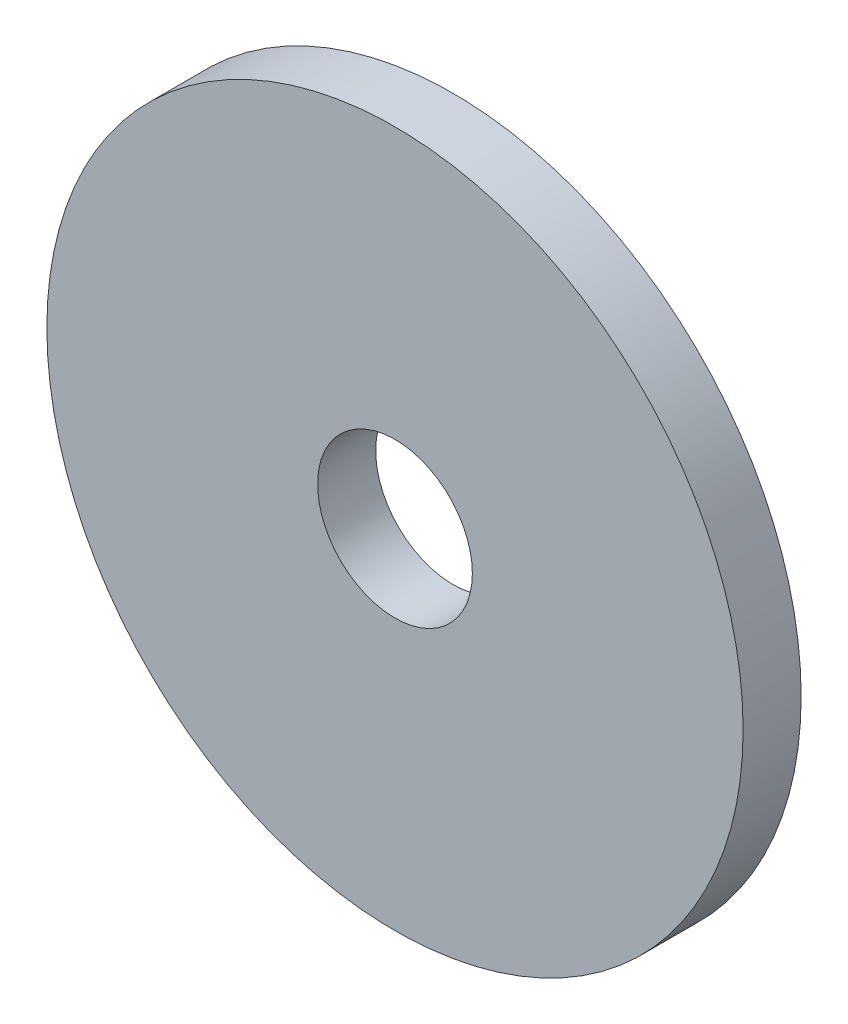
ISO-10303-21;
HEADER;
FILE_DESCRIPTION(('STEP AP214'),'2;1');
FILE_NAME('part.step','',(''),(''),'','','');
FILE_SCHEMA(('AUTOMOTIVE_DESIGN { 1 0 10303 214 1 1 1 1 }'));
ENDSEC;
DATA;
#1=APPLICATION_CONTEXT('core data for automotive mechanical design processes');
#2=APPLICATION_PROTOCOL_DEFINITION('international standard','automotive_design',2000,#1);
#3=PRODUCT_CONTEXT('',#1,'mechanical');
#4=PRODUCT('Part','Part','',(#3));
#5=PRODUCT_RELATED_PRODUCT_CATEGORY('part','',(#4));
#6=PRODUCT_DEFINITION_FORMATION('','',#4);
#7=PRODUCT_DEFINITION_CONTEXT('part definition',#1,'design');
#8=PRODUCT_DEFINITION('design','',#6,#7);
#9=PRODUCT_DEFINITION_SHAPE('','',#8);
#10=(LENGTH_UNIT() NAMED_UNIT(*) SI_UNIT(.MILLI.,.METRE.));
#11=(NAMED_UNIT(*) PLANE_ANGLE_UNIT() SI_UNIT($,.RADIAN.));
#12=(NAMED_UNIT(*) SI_UNIT($,.STERADIAN.) SOLID_ANGLE_UNIT());
#13=UNCERTAINTY_MEASURE_WITH_UNIT(LENGTH_MEASURE(1.E-05),#10,'distance_accuracy_value','');
#14=(GEOMETRIC_REPRESENTATION_CONTEXT(3) GLOBAL_UNCERTAINTY_ASSIGNED_CONTEXT((#13)) GLOBAL_UNIT_ASSIGNED_CONTEXT((#10,
#11,#12)) REPRESENTATION_CONTEXT('',''));
#15=CARTESIAN_POINT('',(0.,0.,0.));
#16=DIRECTION('',(0.,0.,1.));
#17=DIRECTION('',(1.,0.,0.));
#18=AXIS2_PLACEMENT_3D('',#15,#16,#17);
#19=CARTESIAN_POINT('',(0.,0.,3.));
#20=DIRECTION('',(0.,0.,1.));
#21=DIRECTION('',(1.,0.,0.));
#22=AXIS2_PLACEMENT_3D('',#19,#20,#21);
#23=PLANE('',#22);
#24=CARTESIAN_POINT('',(0.,0.,3.));
#25=DIRECTION('',(0.,0.,1.));
#26=DIRECTION('',(1.,0.,0.));
#27=AXIS2_PLACEMENT_3D('',#24,#25,#26);
#28=CIRCLE('',#27,18.);
#29=CARTESIAN_POINT('',(18.,0.,3.));
#30=VERTEX_POINT('',#29);
#31=EDGE_CURVE('E10',#30,#30,#28,.T.);
#32=ORIENTED_EDGE('',*,*,#31,.T.);
#33=EDGE_LOOP('',(#32));
#34=FACE_BOUND('',#33,.T.);
#35=CARTESIAN_POINT('',(0.,0.,3.));
#36=DIRECTION('',(0.,0.,1.));
#37=DIRECTION('',(1.,0.,0.));
#38=AXIS2_PLACEMENT_3D('',#35,#36,#37);
#39=CIRCLE('',#38,4.);
#40=CARTESIAN_POINT('',(4.,0.,3.));
#41=VERTEX_POINT('',#40);
#42=EDGE_CURVE('E50',#41,#41,#39,.T.);
#43=ORIENTED_EDGE('',*,*,#42,.F.);
#44=EDGE_LOOP('',(#43));
#45=FACE_BOUND('',#44,.T.);
#46=ADVANCED_FACE('F37',(#34,#45),#23,.T.);
#47=CARTESIAN_POINT('',(0.,0.,0.));
#48=DIRECTION('',(0.,0.,1.));
#49=DIRECTION('',(1.,0.,0.));
#50=AXIS2_PLACEMENT_3D('',#47,#48,#49);
#51=PLANE('',#50);
#52=CARTESIAN_POINT('',(0.,0.,0.));
#53=DIRECTION('',(0.,0.,1.));
#54=DIRECTION('',(1.,0.,0.));
#55=AXIS2_PLACEMENT_3D('',#52,#53,#54);
#56=CIRCLE('',#55,18.);
#57=CARTESIAN_POINT('',(18.,0.,0.));
#58=VERTEX_POINT('',#57);
#59=EDGE_CURVE('E41',#58,#58,#56,.T.);
#60=ORIENTED_EDGE('',*,*,#59,.F.);
#61=EDGE_LOOP('',(#60));
#62=FACE_BOUND('',#61,.T.);
#63=CARTESIAN_POINT('',(0.,0.,0.));
#64=DIRECTION('',(0.,0.,1.));
#65=DIRECTION('',(1.,0.,0.));
#66=AXIS2_PLACEMENT_3D('',#63,#64,#65);
#67=CIRCLE('',#66,4.);
#68=CARTESIAN_POINT('',(4.,0.,0.));
#69=VERTEX_POINT('',#68);
#70=EDGE_CURVE('E52',#69,#69,#67,.T.);
#71=ORIENTED_EDGE('',*,*,#70,.T.);
#72=EDGE_LOOP('',(#71));
#73=FACE_BOUND('',#72,.T.);
#74=ADVANCED_FACE('F64',(#62,#73),#51,.F.);
#75=CARTESIAN_POINT('',(0.,0.,3.));
#76=DIRECTION('',(0.,0.,-1.));
#77=DIRECTION('',(-1.,0.,0.));
#78=AXIS2_PLACEMENT_3D('',#75,#76,#77);
#79=CYLINDRICAL_SURFACE('',#78,18.);
#80=ORIENTED_EDGE('',*,*,#31,.F.);
#81=EDGE_LOOP('',(#80));
#82=FACE_BOUND('',#81,.T.);
#83=ORIENTED_EDGE('',*,*,#59,.T.);
#84=EDGE_LOOP('',(#83));
#85=FACE_BOUND('',#84,.T.);
#86=ADVANCED_FACE('F39',(#82,#85),#79,.T.);
#87=CARTESIAN_POINT('',(0.,0.,3.));
#88=DIRECTION('',(0.,0.,-1.));
#89=DIRECTION('',(-1.,0.,0.));
#90=AXIS2_PLACEMENT_3D('',#87,#88,#89);
#91=CYLINDRICAL_SURFACE('',#90,4.);
#92=ORIENTED_EDGE('',*,*,#42,.T.);
#93=EDGE_LOOP('',(#92));
#94=FACE_BOUND('',#93,.T.);
#95=ORIENTED_EDGE('',*,*,#70,.F.);
#96=EDGE_LOOP('',(#95));
#97=FACE_BOUND('',#96,.T.);
#98=ADVANCED_FACE('F60',(#94,#97),#91,.F.);
#99=CLOSED_SHELL('',(#46,#74,#86,#98));
#100=MANIFOLD_SOLID_BREP('B2',#99);
#101=ADVANCED_BREP_SHAPE_REPRESENTATION('',(#18,#100),#14);
#102=SHAPE_DEFINITION_REPRESENTATION(#9,#101);
ENDSEC;
END-ISO-10303-21;
